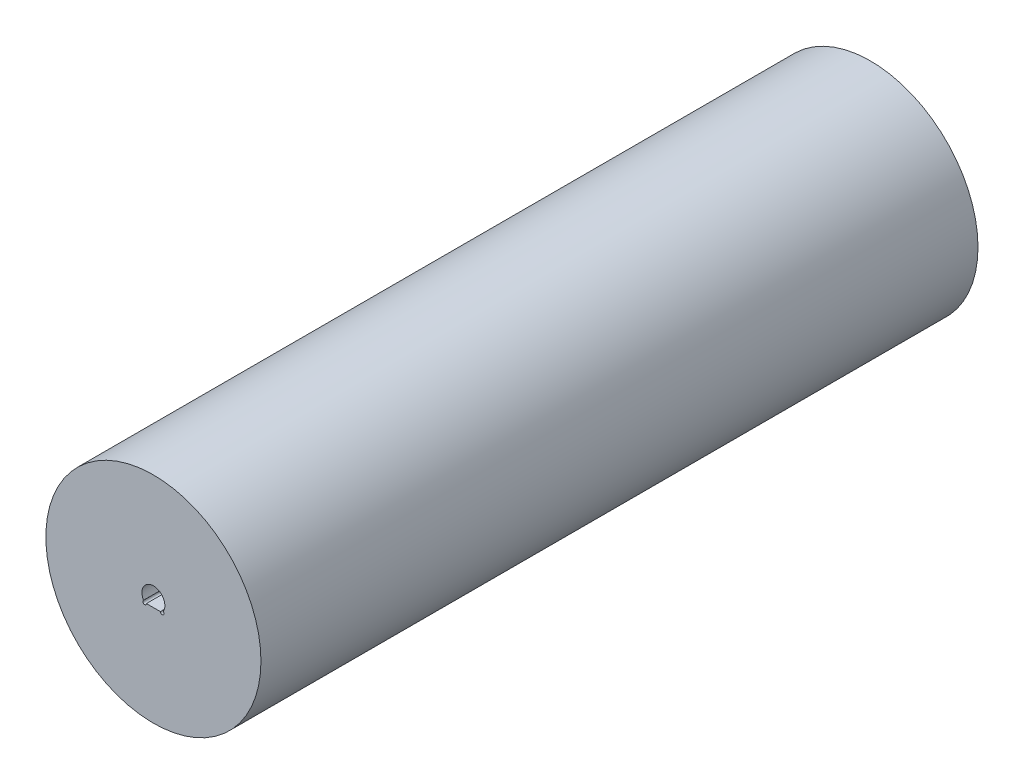
ISO-10303-21;
HEADER;
FILE_DESCRIPTION(('STEP AP214'),'2;1');
FILE_NAME('part.step','',(''),(''),'','','');
FILE_SCHEMA(('AUTOMOTIVE_DESIGN { 1 0 10303 214 1 1 1 1 }'));
ENDSEC;
DATA;
#1=APPLICATION_CONTEXT('core data for automotive mechanical design processes');
#2=APPLICATION_PROTOCOL_DEFINITION('international standard','automotive_design',2000,#1);
#3=PRODUCT_CONTEXT('',#1,'mechanical');
#4=PRODUCT('Part','Part','',(#3));
#5=PRODUCT_RELATED_PRODUCT_CATEGORY('part','',(#4));
#6=PRODUCT_DEFINITION_FORMATION('','',#4);
#7=PRODUCT_DEFINITION_CONTEXT('part definition',#1,'design');
#8=PRODUCT_DEFINITION('design','',#6,#7);
#9=PRODUCT_DEFINITION_SHAPE('','',#8);
#10=(LENGTH_UNIT() NAMED_UNIT(*) SI_UNIT(.MILLI.,.METRE.));
#11=(NAMED_UNIT(*) PLANE_ANGLE_UNIT() SI_UNIT($,.RADIAN.));
#12=(NAMED_UNIT(*) SI_UNIT($,.STERADIAN.) SOLID_ANGLE_UNIT());
#13=UNCERTAINTY_MEASURE_WITH_UNIT(LENGTH_MEASURE(1.E-05),#10,'distance_accuracy_value','');
#14=(GEOMETRIC_REPRESENTATION_CONTEXT(3) GLOBAL_UNCERTAINTY_ASSIGNED_CONTEXT((#13)) GLOBAL_UNIT_ASSIGNED_CONTEXT((#10,
#11,#12)) REPRESENTATION_CONTEXT('',''));
#15=CARTESIAN_POINT('',(0.,0.,0.));
#16=DIRECTION('',(0.,0.,1.));
#17=DIRECTION('',(1.,0.,0.));
#18=AXIS2_PLACEMENT_3D('',#15,#16,#17);
#19=CARTESIAN_POINT('',(0.,0.,100.));
#20=DIRECTION('',(0.,0.,-1.));
#21=DIRECTION('',(-1.,0.,0.));
#22=AXIS2_PLACEMENT_3D('',#19,#20,#21);
#23=CYLINDRICAL_SURFACE('',#22,15.);
#24=CARTESIAN_POINT('',(0.,0.,100.));
#25=DIRECTION('',(0.,0.,1.));
#26=DIRECTION('',(1.,0.,0.));
#27=AXIS2_PLACEMENT_3D('',#24,#25,#26);
#28=CIRCLE('',#27,15.);
#29=CARTESIAN_POINT('',(15.,0.,100.));
#30=VERTEX_POINT('',#29);
#31=EDGE_CURVE('E11',#30,#30,#28,.T.);
#32=ORIENTED_EDGE('',*,*,#31,.F.);
#33=EDGE_LOOP('',(#32));
#34=FACE_BOUND('',#33,.T.);
#35=CARTESIAN_POINT('',(0.,0.,0.));
#36=DIRECTION('',(0.,0.,1.));
#37=DIRECTION('',(1.,0.,0.));
#38=AXIS2_PLACEMENT_3D('',#35,#36,#37);
#39=CIRCLE('',#38,15.);
#40=CARTESIAN_POINT('',(15.,0.,0.));
#41=VERTEX_POINT('',#40);
#42=EDGE_CURVE('E42',#41,#41,#39,.T.);
#43=ORIENTED_EDGE('',*,*,#42,.T.);
#44=EDGE_LOOP('',(#43));
#45=FACE_BOUND('',#44,.T.);
#46=ADVANCED_FACE('F39',(#34,#45),#23,.T.);
#47=CARTESIAN_POINT('',(0.,0.,100.));
#48=DIRECTION('',(0.,0.,1.));
#49=DIRECTION('',(1.,0.,0.));
#50=AXIS2_PLACEMENT_3D('',#47,#48,#49);
#51=PLANE('',#50);
#52=CARTESIAN_POINT('',(1.225,-1.02925944251195,100.));
#53=DIRECTION('',(0.,0.,1.));
#54=DIRECTION('',(1.,0.,0.));
#55=AXIS2_PLACEMENT_3D('',#52,#53,#54);
#56=CIRCLE('',#55,0.25);
#57=CARTESIAN_POINT('',(0.975,-1.02925944251195,100.));
#58=VERTEX_POINT('',#57);
#59=CARTESIAN_POINT('',(1.37037663428464,-0.825874009886918,100.));
#60=VERTEX_POINT('',#59);
#61=EDGE_CURVE('E53',#58,#60,#56,.T.);
#62=ORIENTED_EDGE('',*,*,#61,.F.);
#63=DIRECTION('',(1.,0.,0.));
#64=VECTOR('',#63,1.);
#65=CARTESIAN_POINT('',(-0.975,-1.02925944251195,100.));
#66=LINE('',#65,#64);
#67=CARTESIAN_POINT('',(-0.975,-1.02925944251195,100.));
#68=VERTEX_POINT('',#67);
#69=EDGE_CURVE('E104',#68,#58,#66,.T.);
#70=ORIENTED_EDGE('',*,*,#69,.F.);
#71=CARTESIAN_POINT('',(-1.225,-1.02925944251195,100.));
#72=DIRECTION('',(0.,0.,1.));
#73=DIRECTION('',(1.,0.,0.));
#74=AXIS2_PLACEMENT_3D('',#71,#72,#73);
#75=CIRCLE('',#74,0.25);
#76=CARTESIAN_POINT('',(-1.37037663428464,-0.825874009886918,100.));
#77=VERTEX_POINT('',#76);
#78=EDGE_CURVE('E112',#77,#68,#75,.T.);
#79=ORIENTED_EDGE('',*,*,#78,.F.);
#80=CARTESIAN_POINT('',(0.,0.,100.));
#81=DIRECTION('',(0.,0.,1.));
#82=DIRECTION('',(1.,0.,0.));
#83=AXIS2_PLACEMENT_3D('',#80,#81,#82);
#84=CIRCLE('',#83,1.6);
#85=EDGE_CURVE('E88',#60,#77,#84,.T.);
#86=ORIENTED_EDGE('',*,*,#85,.F.);
#87=EDGE_LOOP('',(#62,#70,#79,#86));
#88=FACE_BOUND('',#87,.T.);
#89=ORIENTED_EDGE('',*,*,#31,.T.);
#90=EDGE_LOOP('',(#89));
#91=FACE_BOUND('',#90,.T.);
#92=ADVANCED_FACE('F118',(#88,#91),#51,.T.);
#93=CARTESIAN_POINT('',(0.,0.,0.));
#94=DIRECTION('',(0.,0.,1.));
#95=DIRECTION('',(1.,0.,0.));
#96=AXIS2_PLACEMENT_3D('',#93,#94,#95);
#97=PLANE('',#96);
#98=CARTESIAN_POINT('',(0.,0.,0.));
#99=DIRECTION('',(0.,0.,-1.));
#100=DIRECTION('',(-1.,0.,0.));
#101=AXIS2_PLACEMENT_3D('',#98,#99,#100);
#102=CIRCLE('',#101,11.);
#103=CARTESIAN_POINT('',(-11.,0.,0.));
#104=VERTEX_POINT('',#103);
#105=EDGE_CURVE('E177',#104,#104,#102,.T.);
#106=ORIENTED_EDGE('',*,*,#105,.F.);
#107=EDGE_LOOP('',(#106));
#108=FACE_BOUND('',#107,.T.);
#109=ORIENTED_EDGE('',*,*,#42,.F.);
#110=EDGE_LOOP('',(#109));
#111=FACE_BOUND('',#110,.T.);
#112=ADVANCED_FACE('F130',(#108,#111),#97,.F.);
#113=CARTESIAN_POINT('',(1.225,-1.02925944251195,90.));
#114=DIRECTION('',(0.,0.,1.));
#115=DIRECTION('',(1.,0.,0.));
#116=AXIS2_PLACEMENT_3D('',#113,#114,#115);
#117=CYLINDRICAL_SURFACE('',#116,0.25);
#118=ORIENTED_EDGE('',*,*,#61,.T.);
#119=DIRECTION('',(0.,0.,1.));
#120=VECTOR('',#119,1.);
#121=CARTESIAN_POINT('',(1.37037663428464,-0.825874009886918,90.));
#122=LINE('',#121,#120);
#123=CARTESIAN_POINT('',(1.37037663428464,-0.825874009886918,90.));
#124=VERTEX_POINT('',#123);
#125=EDGE_CURVE('E76',#124,#60,#122,.T.);
#126=ORIENTED_EDGE('',*,*,#125,.F.);
#127=CARTESIAN_POINT('',(1.225,-1.02925944251195,90.));
#128=DIRECTION('',(0.,0.,1.));
#129=DIRECTION('',(1.,0.,0.));
#130=AXIS2_PLACEMENT_3D('',#127,#128,#129);
#131=CIRCLE('',#130,0.25);
#132=CARTESIAN_POINT('',(0.975,-1.02925944251195,90.));
#133=VERTEX_POINT('',#132);
#134=EDGE_CURVE('E102',#133,#124,#131,.T.);
#135=ORIENTED_EDGE('',*,*,#134,.F.);
#136=DIRECTION('',(0.,0.,1.));
#137=VECTOR('',#136,1.);
#138=CARTESIAN_POINT('',(0.975,-1.02925944251195,90.));
#139=LINE('',#138,#137);
#140=EDGE_CURVE('E61',#133,#58,#139,.T.);
#141=ORIENTED_EDGE('',*,*,#140,.T.);
#142=EDGE_LOOP('',(#118,#126,#135,#141));
#143=FACE_BOUND('',#142,.T.);
#144=ADVANCED_FACE('F123',(#143),#117,.F.);
#145=CARTESIAN_POINT('',(-0.975,-1.02925944251195,90.));
#146=DIRECTION('',(0.,-1.,0.));
#147=DIRECTION('',(0.,0.,-1.));
#148=AXIS2_PLACEMENT_3D('',#145,#146,#147);
#149=PLANE('',#148);
#150=ORIENTED_EDGE('',*,*,#69,.T.);
#151=ORIENTED_EDGE('',*,*,#140,.F.);
#152=DIRECTION('',(1.,0.,0.));
#153=VECTOR('',#152,1.);
#154=CARTESIAN_POINT('',(-0.975,-1.02925944251195,90.));
#155=LINE('',#154,#153);
#156=CARTESIAN_POINT('',(-0.975,-1.02925944251195,90.));
#157=VERTEX_POINT('',#156);
#158=EDGE_CURVE('E99',#157,#133,#155,.T.);
#159=ORIENTED_EDGE('',*,*,#158,.F.);
#160=DIRECTION('',(0.,0.,1.));
#161=VECTOR('',#160,1.);
#162=CARTESIAN_POINT('',(-0.975,-1.02925944251195,90.));
#163=LINE('',#162,#161);
#164=EDGE_CURVE('E92',#157,#68,#163,.T.);
#165=ORIENTED_EDGE('',*,*,#164,.T.);
#166=EDGE_LOOP('',(#150,#151,#159,#165));
#167=FACE_BOUND('',#166,.T.);
#168=ADVANCED_FACE('F121',(#167),#149,.F.);
#169=CARTESIAN_POINT('',(-1.225,-1.02925944251195,90.));
#170=DIRECTION('',(0.,0.,1.));
#171=DIRECTION('',(1.,0.,0.));
#172=AXIS2_PLACEMENT_3D('',#169,#170,#171);
#173=CYLINDRICAL_SURFACE('',#172,0.25);
#174=ORIENTED_EDGE('',*,*,#78,.T.);
#175=ORIENTED_EDGE('',*,*,#164,.F.);
#176=CARTESIAN_POINT('',(-1.225,-1.02925944251195,90.));
#177=DIRECTION('',(0.,0.,1.));
#178=DIRECTION('',(1.,0.,0.));
#179=AXIS2_PLACEMENT_3D('',#176,#177,#178);
#180=CIRCLE('',#179,0.25);
#181=CARTESIAN_POINT('',(-1.37037663428464,-0.825874009886918,90.));
#182=VERTEX_POINT('',#181);
#183=EDGE_CURVE('E95',#182,#157,#180,.T.);
#184=ORIENTED_EDGE('',*,*,#183,.F.);
#185=DIRECTION('',(0.,0.,1.));
#186=VECTOR('',#185,1.);
#187=CARTESIAN_POINT('',(-1.37037663428464,-0.825874009886918,90.));
#188=LINE('',#187,#186);
#189=EDGE_CURVE('E81',#182,#77,#188,.T.);
#190=ORIENTED_EDGE('',*,*,#189,.T.);
#191=EDGE_LOOP('',(#174,#175,#184,#190));
#192=FACE_BOUND('',#191,.T.);
#193=ADVANCED_FACE('F96',(#192),#173,.F.);
#194=CARTESIAN_POINT('',(0.,0.,90.));
#195=DIRECTION('',(0.,0.,1.));
#196=DIRECTION('',(1.,0.,0.));
#197=AXIS2_PLACEMENT_3D('',#194,#195,#196);
#198=CYLINDRICAL_SURFACE('',#197,1.6);
#199=ORIENTED_EDGE('',*,*,#85,.T.);
#200=ORIENTED_EDGE('',*,*,#189,.F.);
#201=CARTESIAN_POINT('',(0.,0.,90.));
#202=DIRECTION('',(0.,0.,1.));
#203=DIRECTION('',(1.,0.,0.));
#204=AXIS2_PLACEMENT_3D('',#201,#202,#203);
#205=CIRCLE('',#204,1.6);
#206=EDGE_CURVE('E85',#124,#182,#205,.T.);
#207=ORIENTED_EDGE('',*,*,#206,.F.);
#208=ORIENTED_EDGE('',*,*,#125,.T.);
#209=EDGE_LOOP('',(#199,#200,#207,#208));
#210=FACE_BOUND('',#209,.T.);
#211=ADVANCED_FACE('F83',(#210),#198,.F.);
#212=CARTESIAN_POINT('',(1.225,-1.02925944251195,90.));
#213=DIRECTION('',(0.,0.,1.));
#214=DIRECTION('',(1.,0.,0.));
#215=AXIS2_PLACEMENT_3D('',#212,#213,#214);
#216=PLANE('',#215);
#217=ORIENTED_EDGE('',*,*,#134,.T.);
#218=ORIENTED_EDGE('',*,*,#206,.T.);
#219=ORIENTED_EDGE('',*,*,#183,.T.);
#220=ORIENTED_EDGE('',*,*,#158,.T.);
#221=EDGE_LOOP('',(#217,#218,#219,#220));
#222=FACE_BOUND('',#221,.T.);
#223=ADVANCED_FACE('F101',(#222),#216,.T.);
#224=CARTESIAN_POINT('',(0.,0.,7.));
#225=DIRECTION('',(0.,0.,-1.));
#226=DIRECTION('',(-1.,0.,0.));
#227=AXIS2_PLACEMENT_3D('',#224,#225,#226);
#228=CYLINDRICAL_SURFACE('',#227,11.);
#229=CARTESIAN_POINT('',(0.,0.,7.));
#230=DIRECTION('',(0.,0.,-1.));
#231=DIRECTION('',(-1.,0.,0.));
#232=AXIS2_PLACEMENT_3D('',#229,#230,#231);
#233=CIRCLE('',#232,11.);
#234=CARTESIAN_POINT('',(-11.,0.,7.));
#235=VERTEX_POINT('',#234);
#236=EDGE_CURVE('E110',#235,#235,#233,.T.);
#237=ORIENTED_EDGE('',*,*,#236,.F.);
#238=EDGE_LOOP('',(#237));
#239=FACE_BOUND('',#238,.T.);
#240=ORIENTED_EDGE('',*,*,#105,.T.);
#241=EDGE_LOOP('',(#240));
#242=FACE_BOUND('',#241,.T.);
#243=ADVANCED_FACE('F155',(#239,#242),#228,.F.);
#244=CARTESIAN_POINT('',(0.,0.,7.));
#245=DIRECTION('',(0.,0.,-1.));
#246=DIRECTION('',(-1.,0.,0.));
#247=AXIS2_PLACEMENT_3D('',#244,#245,#246);
#248=PLANE('',#247);
#249=CARTESIAN_POINT('',(0.,0.,7.));
#250=DIRECTION('',(0.,0.,-1.));
#251=DIRECTION('',(-1.,0.,0.));
#252=AXIS2_PLACEMENT_3D('',#249,#250,#251);
#253=CIRCLE('',#252,5.);
#254=CARTESIAN_POINT('',(-5.,0.,7.));
#255=VERTEX_POINT('',#254);
#256=EDGE_CURVE('E178',#255,#255,#253,.T.);
#257=ORIENTED_EDGE('',*,*,#256,.F.);
#258=EDGE_LOOP('',(#257));
#259=FACE_BOUND('',#258,.T.);
#260=ORIENTED_EDGE('',*,*,#236,.T.);
#261=EDGE_LOOP('',(#260));
#262=FACE_BOUND('',#261,.T.);
#263=ADVANCED_FACE('F158',(#259,#262),#248,.T.);
#264=CARTESIAN_POINT('',(0.,0.,77.));
#265=DIRECTION('',(0.,0.,-1.));
#266=DIRECTION('',(-1.,0.,0.));
#267=AXIS2_PLACEMENT_3D('',#264,#265,#266);
#268=CYLINDRICAL_SURFACE('',#267,5.);
#269=CARTESIAN_POINT('',(0.,0.,77.));
#270=DIRECTION('',(0.,0.,-1.));
#271=DIRECTION('',(-1.,0.,0.));
#272=AXIS2_PLACEMENT_3D('',#269,#270,#271);
#273=CIRCLE('',#272,5.);
#274=CARTESIAN_POINT('',(-5.,0.,77.));
#275=VERTEX_POINT('',#274);
#276=EDGE_CURVE('E176',#275,#275,#273,.T.);
#277=ORIENTED_EDGE('',*,*,#276,.F.);
#278=EDGE_LOOP('',(#277));
#279=FACE_BOUND('',#278,.T.);
#280=ORIENTED_EDGE('',*,*,#256,.T.);
#281=EDGE_LOOP('',(#280));
#282=FACE_BOUND('',#281,.T.);
#283=ADVANCED_FACE('F164',(#279,#282),#268,.F.);
#284=CARTESIAN_POINT('',(0.,0.,77.));
#285=DIRECTION('',(0.,0.,-1.));
#286=DIRECTION('',(-1.,0.,0.));
#287=AXIS2_PLACEMENT_3D('',#284,#285,#286);
#288=PLANE('',#287);
#289=ORIENTED_EDGE('',*,*,#276,.T.);
#290=EDGE_LOOP('',(#289));
#291=FACE_BOUND('',#290,.T.);
#292=ADVANCED_FACE('F168',(#291),#288,.T.);
#293=CLOSED_SHELL('',(#46,#92,#112,#144,#168,#193,#211,#223,#243,#263,#283,#292));
#294=MANIFOLD_SOLID_BREP('B2',#293);
#295=ADVANCED_BREP_SHAPE_REPRESENTATION('',(#18,#294),#14);
#296=SHAPE_DEFINITION_REPRESENTATION(#9,#295);
ENDSEC;
END-ISO-10303-21;
